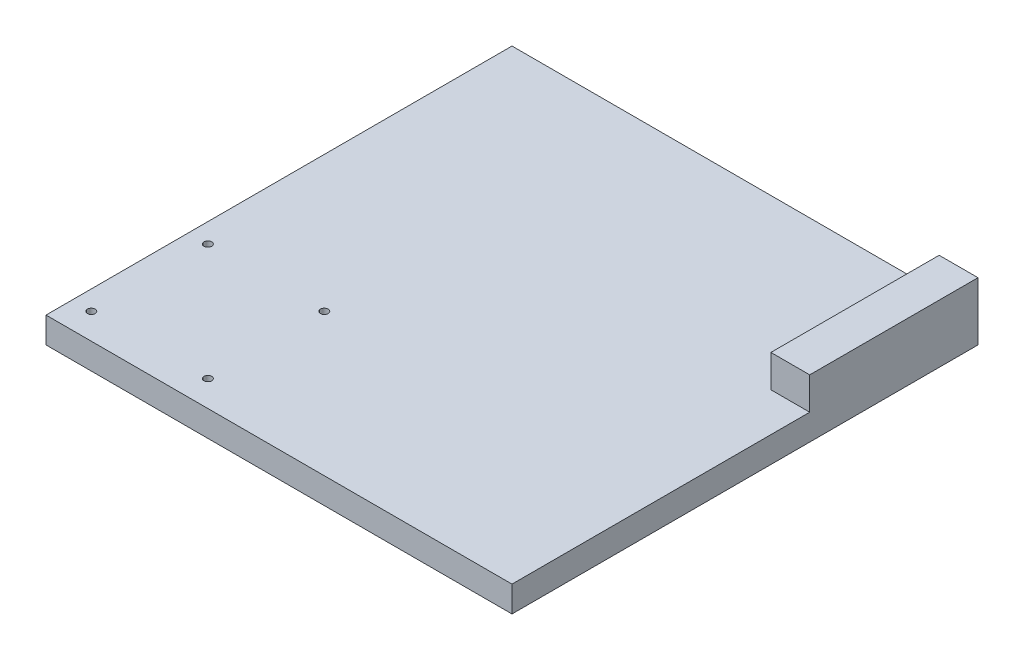
ISO-10303-21;
HEADER;
FILE_DESCRIPTION(('STEP AP214'),'2;1');
FILE_NAME('part.step','',(''),(''),'','','');
FILE_SCHEMA(('AUTOMOTIVE_DESIGN { 1 0 10303 214 1 1 1 1 }'));
ENDSEC;
DATA;
#1=APPLICATION_CONTEXT('core data for automotive mechanical design processes');
#2=APPLICATION_PROTOCOL_DEFINITION('international standard','automotive_design',2000,#1);
#3=PRODUCT_CONTEXT('',#1,'mechanical');
#4=PRODUCT('Part','Part','',(#3));
#5=PRODUCT_RELATED_PRODUCT_CATEGORY('part','',(#4));
#6=PRODUCT_DEFINITION_FORMATION('','',#4);
#7=PRODUCT_DEFINITION_CONTEXT('part definition',#1,'design');
#8=PRODUCT_DEFINITION('design','',#6,#7);
#9=PRODUCT_DEFINITION_SHAPE('','',#8);
#10=(LENGTH_UNIT() NAMED_UNIT(*) SI_UNIT(.MILLI.,.METRE.));
#11=(NAMED_UNIT(*) PLANE_ANGLE_UNIT() SI_UNIT($,.RADIAN.));
#12=(NAMED_UNIT(*) SI_UNIT($,.STERADIAN.) SOLID_ANGLE_UNIT());
#13=UNCERTAINTY_MEASURE_WITH_UNIT(LENGTH_MEASURE(1.E-05),#10,'distance_accuracy_value','');
#14=(GEOMETRIC_REPRESENTATION_CONTEXT(3) GLOBAL_UNCERTAINTY_ASSIGNED_CONTEXT((#13)) GLOBAL_UNIT_ASSIGNED_CONTEXT((#10,
#11,#12)) REPRESENTATION_CONTEXT('',''));
#15=CARTESIAN_POINT('',(0.,0.,0.));
#16=DIRECTION('',(0.,0.,1.));
#17=DIRECTION('',(1.,0.,0.));
#18=AXIS2_PLACEMENT_3D('',#15,#16,#17);
#19=CARTESIAN_POINT('',(0.,20.,-360.));
#20=DIRECTION('',(1.,0.,0.));
#21=DIRECTION('',(0.,0.,-1.));
#22=AXIS2_PLACEMENT_3D('',#19,#20,#21);
#23=PLANE('',#22);
#24=DIRECTION('',(0.,0.,1.));
#25=VECTOR('',#24,1.);
#26=CARTESIAN_POINT('',(0.,0.,-360.));
#27=LINE('',#26,#25);
#28=CARTESIAN_POINT('',(0.,0.,-360.));
#29=VERTEX_POINT('',#28);
#30=CARTESIAN_POINT('',(0.,0.,0.));
#31=VERTEX_POINT('',#30);
#32=EDGE_CURVE('E124',#29,#31,#27,.T.);
#33=ORIENTED_EDGE('',*,*,#32,.T.);
#34=DIRECTION('',(0.,-1.,0.));
#35=VECTOR('',#34,1.);
#36=CARTESIAN_POINT('',(0.,20.,0.));
#37=LINE('',#36,#35);
#38=CARTESIAN_POINT('',(0.,20.,0.));
#39=VERTEX_POINT('',#38);
#40=EDGE_CURVE('E11',#39,#31,#37,.T.);
#41=ORIENTED_EDGE('',*,*,#40,.F.);
#42=DIRECTION('',(0.,0.,1.));
#43=VECTOR('',#42,1.);
#44=CARTESIAN_POINT('',(0.,20.,-360.));
#45=LINE('',#44,#43);
#46=CARTESIAN_POINT('',(0.,20.,-360.));
#47=VERTEX_POINT('',#46);
#48=EDGE_CURVE('E133',#47,#39,#45,.T.);
#49=ORIENTED_EDGE('',*,*,#48,.F.);
#50=DIRECTION('',(0.,-1.,0.));
#51=VECTOR('',#50,1.);
#52=CARTESIAN_POINT('',(0.,20.,-360.));
#53=LINE('',#52,#51);
#54=EDGE_CURVE('E140',#47,#29,#53,.T.);
#55=ORIENTED_EDGE('',*,*,#54,.T.);
#56=EDGE_LOOP('',(#33,#41,#49,#55));
#57=FACE_BOUND('',#56,.T.);
#58=ADVANCED_FACE('F41',(#57),#23,.F.);
#59=CARTESIAN_POINT('',(0.,20.,0.));
#60=DIRECTION('',(0.,0.,-1.));
#61=DIRECTION('',(-1.,0.,0.));
#62=AXIS2_PLACEMENT_3D('',#59,#60,#61);
#63=PLANE('',#62);
#64=DIRECTION('',(1.,0.,0.));
#65=VECTOR('',#64,1.);
#66=CARTESIAN_POINT('',(0.,0.,0.));
#67=LINE('',#66,#65);
#68=CARTESIAN_POINT('',(360.,0.,0.));
#69=VERTEX_POINT('',#68);
#70=EDGE_CURVE('E127',#31,#69,#67,.T.);
#71=ORIENTED_EDGE('',*,*,#70,.T.);
#72=DIRECTION('',(0.,-1.,0.));
#73=VECTOR('',#72,1.);
#74=CARTESIAN_POINT('',(360.,20.,0.));
#75=LINE('',#74,#73);
#76=CARTESIAN_POINT('',(360.,20.,0.));
#77=VERTEX_POINT('',#76);
#78=EDGE_CURVE('E49',#77,#69,#75,.T.);
#79=ORIENTED_EDGE('',*,*,#78,.F.);
#80=DIRECTION('',(1.,0.,0.));
#81=VECTOR('',#80,1.);
#82=CARTESIAN_POINT('',(0.,20.,0.));
#83=LINE('',#82,#81);
#84=EDGE_CURVE('E136',#39,#77,#83,.T.);
#85=ORIENTED_EDGE('',*,*,#84,.F.);
#86=ORIENTED_EDGE('',*,*,#40,.T.);
#87=EDGE_LOOP('',(#71,#79,#85,#86));
#88=FACE_BOUND('',#87,.T.);
#89=ADVANCED_FACE('F207',(#88),#63,.F.);
#90=CARTESIAN_POINT('',(360.,20.,0.));
#91=DIRECTION('',(-1.,0.,0.));
#92=DIRECTION('',(0.,0.,1.));
#93=AXIS2_PLACEMENT_3D('',#90,#91,#92);
#94=PLANE('',#93);
#95=DIRECTION('',(0.,0.,-1.));
#96=VECTOR('',#95,1.);
#97=CARTESIAN_POINT('',(360.,0.,0.));
#98=LINE('',#97,#96);
#99=CARTESIAN_POINT('',(360.,0.,-360.));
#100=VERTEX_POINT('',#99);
#101=EDGE_CURVE('E143',#69,#100,#98,.T.);
#102=ORIENTED_EDGE('',*,*,#101,.T.);
#103=DIRECTION('',(0.,-1.,0.));
#104=VECTOR('',#103,1.);
#105=CARTESIAN_POINT('',(360.,20.,-360.));
#106=LINE('',#105,#104);
#107=CARTESIAN_POINT('',(360.,45.,-360.));
#108=VERTEX_POINT('',#107);
#109=EDGE_CURVE('E148',#108,#100,#106,.T.);
#110=ORIENTED_EDGE('',*,*,#109,.F.);
#111=DIRECTION('',(0.,0.,-1.));
#112=VECTOR('',#111,1.);
#113=CARTESIAN_POINT('',(360.,45.,-360.));
#114=LINE('',#113,#112);
#115=CARTESIAN_POINT('',(360.,45.,-230.));
#116=VERTEX_POINT('',#115);
#117=EDGE_CURVE('E116',#116,#108,#114,.T.);
#118=ORIENTED_EDGE('',*,*,#117,.F.);
#119=DIRECTION('',(0.,-1.,0.));
#120=VECTOR('',#119,1.);
#121=CARTESIAN_POINT('',(360.,45.,-230.));
#122=LINE('',#121,#120);
#123=CARTESIAN_POINT('',(360.,20.,-230.));
#124=VERTEX_POINT('',#123);
#125=EDGE_CURVE('E129',#116,#124,#122,.T.);
#126=ORIENTED_EDGE('',*,*,#125,.T.);
#127=DIRECTION('',(0.,0.,-1.));
#128=VECTOR('',#127,1.);
#129=CARTESIAN_POINT('',(360.,20.,0.));
#130=LINE('',#129,#128);
#131=EDGE_CURVE('E63',#77,#124,#130,.T.);
#132=ORIENTED_EDGE('',*,*,#131,.F.);
#133=ORIENTED_EDGE('',*,*,#78,.T.);
#134=EDGE_LOOP('',(#102,#110,#118,#126,#132,#133));
#135=FACE_BOUND('',#134,.T.);
#136=ADVANCED_FACE('F197',(#135),#94,.F.);
#137=CARTESIAN_POINT('',(360.,20.,-360.));
#138=DIRECTION('',(0.,0.,1.));
#139=DIRECTION('',(1.,0.,0.));
#140=AXIS2_PLACEMENT_3D('',#137,#138,#139);
#141=PLANE('',#140);
#142=DIRECTION('',(-1.,0.,0.));
#143=VECTOR('',#142,1.);
#144=CARTESIAN_POINT('',(360.,0.,-360.));
#145=LINE('',#144,#143);
#146=EDGE_CURVE('E137',#100,#29,#145,.T.);
#147=ORIENTED_EDGE('',*,*,#146,.T.);
#148=ORIENTED_EDGE('',*,*,#54,.F.);
#149=DIRECTION('',(-1.,0.,0.));
#150=VECTOR('',#149,1.);
#151=CARTESIAN_POINT('',(360.,20.,-360.));
#152=LINE('',#151,#150);
#153=CARTESIAN_POINT('',(330.,20.,-360.));
#154=VERTEX_POINT('',#153);
#155=EDGE_CURVE('E123',#154,#47,#152,.T.);
#156=ORIENTED_EDGE('',*,*,#155,.F.);
#157=DIRECTION('',(0.,-1.,0.));
#158=VECTOR('',#157,1.);
#159=CARTESIAN_POINT('',(330.,45.,-360.));
#160=LINE('',#159,#158);
#161=CARTESIAN_POINT('',(330.,45.,-360.));
#162=VERTEX_POINT('',#161);
#163=EDGE_CURVE('E104',#162,#154,#160,.T.);
#164=ORIENTED_EDGE('',*,*,#163,.F.);
#165=DIRECTION('',(-1.,0.,0.));
#166=VECTOR('',#165,1.);
#167=CARTESIAN_POINT('',(330.,45.,-360.));
#168=LINE('',#167,#166);
#169=EDGE_CURVE('E110',#108,#162,#168,.T.);
#170=ORIENTED_EDGE('',*,*,#169,.F.);
#171=ORIENTED_EDGE('',*,*,#109,.T.);
#172=EDGE_LOOP('',(#147,#148,#156,#164,#170,#171));
#173=FACE_BOUND('',#172,.T.);
#174=ADVANCED_FACE('F121',(#173),#141,.F.);
#175=CARTESIAN_POINT('',(0.,20.,0.));
#176=DIRECTION('',(0.,1.,0.));
#177=DIRECTION('',(0.,0.,1.));
#178=AXIS2_PLACEMENT_3D('',#175,#176,#177);
#179=PLANE('',#178);
#180=CARTESIAN_POINT('',(105.,20.,-110.));
#181=DIRECTION('',(0.,1.,0.));
#182=DIRECTION('',(0.,0.,1.));
#183=AXIS2_PLACEMENT_3D('',#180,#181,#182);
#184=CIRCLE('',#183,3.00000000000001);
#185=CARTESIAN_POINT('',(105.,20.,-107.));
#186=VERTEX_POINT('',#185);
#187=EDGE_CURVE('E175',#186,#186,#184,.T.);
#188=ORIENTED_EDGE('',*,*,#187,.F.);
#189=EDGE_LOOP('',(#188));
#190=FACE_BOUND('',#189,.T.);
#191=CARTESIAN_POINT('',(15.,20.,-20.));
#192=DIRECTION('',(0.,1.,0.));
#193=DIRECTION('',(0.,0.,1.));
#194=AXIS2_PLACEMENT_3D('',#191,#192,#193);
#195=CIRCLE('',#194,3.00000000000001);
#196=CARTESIAN_POINT('',(15.,20.,-17.));
#197=VERTEX_POINT('',#196);
#198=EDGE_CURVE('E176',#197,#197,#195,.T.);
#199=ORIENTED_EDGE('',*,*,#198,.F.);
#200=EDGE_LOOP('',(#199));
#201=FACE_BOUND('',#200,.T.);
#202=CARTESIAN_POINT('',(105.,20.,-20.));
#203=DIRECTION('',(0.,1.,0.));
#204=DIRECTION('',(0.,0.,1.));
#205=AXIS2_PLACEMENT_3D('',#202,#203,#204);
#206=CIRCLE('',#205,3.00000000000001);
#207=CARTESIAN_POINT('',(105.,20.,-17.));
#208=VERTEX_POINT('',#207);
#209=EDGE_CURVE('E179',#208,#208,#206,.T.);
#210=ORIENTED_EDGE('',*,*,#209,.F.);
#211=EDGE_LOOP('',(#210));
#212=FACE_BOUND('',#211,.T.);
#213=CARTESIAN_POINT('',(15.,20.,-110.));
#214=DIRECTION('',(0.,1.,0.));
#215=DIRECTION('',(0.,0.,1.));
#216=AXIS2_PLACEMENT_3D('',#213,#214,#215);
#217=CIRCLE('',#216,3.00000000000001);
#218=CARTESIAN_POINT('',(15.,20.,-107.));
#219=VERTEX_POINT('',#218);
#220=EDGE_CURVE('E156',#219,#219,#217,.T.);
#221=ORIENTED_EDGE('',*,*,#220,.F.);
#222=EDGE_LOOP('',(#221));
#223=FACE_BOUND('',#222,.T.);
#224=DIRECTION('',(1.,0.,0.));
#225=VECTOR('',#224,1.);
#226=CARTESIAN_POINT('',(360.,20.,-230.));
#227=LINE('',#226,#225);
#228=CARTESIAN_POINT('',(330.,20.,-230.));
#229=VERTEX_POINT('',#228);
#230=EDGE_CURVE('E119',#229,#124,#227,.T.);
#231=ORIENTED_EDGE('',*,*,#230,.F.);
#232=DIRECTION('',(0.,0.,1.));
#233=VECTOR('',#232,1.);
#234=CARTESIAN_POINT('',(330.,20.,-230.));
#235=LINE('',#234,#233);
#236=EDGE_CURVE('E57',#154,#229,#235,.T.);
#237=ORIENTED_EDGE('',*,*,#236,.F.);
#238=ORIENTED_EDGE('',*,*,#155,.T.);
#239=ORIENTED_EDGE('',*,*,#48,.T.);
#240=ORIENTED_EDGE('',*,*,#84,.T.);
#241=ORIENTED_EDGE('',*,*,#131,.T.);
#242=EDGE_LOOP('',(#231,#237,#238,#239,#240,#241));
#243=FACE_BOUND('',#242,.T.);
#244=ADVANCED_FACE('F188',(#190,#201,#212,#223,#243),#179,.T.);
#245=CARTESIAN_POINT('',(0.,0.,0.));
#246=DIRECTION('',(0.,1.,0.));
#247=DIRECTION('',(0.,0.,1.));
#248=AXIS2_PLACEMENT_3D('',#245,#246,#247);
#249=PLANE('',#248);
#250=CARTESIAN_POINT('',(105.,0.,-110.));
#251=DIRECTION('',(0.,1.,0.));
#252=DIRECTION('',(0.,0.,1.));
#253=AXIS2_PLACEMENT_3D('',#250,#251,#252);
#254=CIRCLE('',#253,3.00000000000001);
#255=CARTESIAN_POINT('',(105.,0.,-107.));
#256=VERTEX_POINT('',#255);
#257=EDGE_CURVE('E44',#256,#256,#254,.T.);
#258=ORIENTED_EDGE('',*,*,#257,.T.);
#259=EDGE_LOOP('',(#258));
#260=FACE_BOUND('',#259,.T.);
#261=CARTESIAN_POINT('',(15.,0.,-20.));
#262=DIRECTION('',(0.,1.,0.));
#263=DIRECTION('',(0.,0.,1.));
#264=AXIS2_PLACEMENT_3D('',#261,#262,#263);
#265=CIRCLE('',#264,3.00000000000001);
#266=CARTESIAN_POINT('',(15.,0.,-17.));
#267=VERTEX_POINT('',#266);
#268=EDGE_CURVE('E158',#267,#267,#265,.T.);
#269=ORIENTED_EDGE('',*,*,#268,.T.);
#270=EDGE_LOOP('',(#269));
#271=FACE_BOUND('',#270,.T.);
#272=CARTESIAN_POINT('',(105.,0.,-20.));
#273=DIRECTION('',(0.,1.,0.));
#274=DIRECTION('',(0.,0.,1.));
#275=AXIS2_PLACEMENT_3D('',#272,#273,#274);
#276=CIRCLE('',#275,3.00000000000001);
#277=CARTESIAN_POINT('',(105.,0.,-17.));
#278=VERTEX_POINT('',#277);
#279=EDGE_CURVE('E155',#278,#278,#276,.T.);
#280=ORIENTED_EDGE('',*,*,#279,.T.);
#281=EDGE_LOOP('',(#280));
#282=FACE_BOUND('',#281,.T.);
#283=CARTESIAN_POINT('',(15.,0.,-110.));
#284=DIRECTION('',(0.,1.,0.));
#285=DIRECTION('',(0.,0.,1.));
#286=AXIS2_PLACEMENT_3D('',#283,#284,#285);
#287=CIRCLE('',#286,3.00000000000001);
#288=CARTESIAN_POINT('',(15.,0.,-107.));
#289=VERTEX_POINT('',#288);
#290=EDGE_CURVE('E152',#289,#289,#287,.T.);
#291=ORIENTED_EDGE('',*,*,#290,.T.);
#292=EDGE_LOOP('',(#291));
#293=FACE_BOUND('',#292,.T.);
#294=ORIENTED_EDGE('',*,*,#32,.F.);
#295=ORIENTED_EDGE('',*,*,#146,.F.);
#296=ORIENTED_EDGE('',*,*,#101,.F.);
#297=ORIENTED_EDGE('',*,*,#70,.F.);
#298=EDGE_LOOP('',(#294,#295,#296,#297));
#299=FACE_BOUND('',#298,.T.);
#300=ADVANCED_FACE('F191',(#260,#271,#282,#293,#299),#249,.F.);
#301=CARTESIAN_POINT('',(330.,45.,-230.));
#302=DIRECTION('',(1.,0.,0.));
#303=DIRECTION('',(0.,0.,-1.));
#304=AXIS2_PLACEMENT_3D('',#301,#302,#303);
#305=PLANE('',#304);
#306=ORIENTED_EDGE('',*,*,#236,.T.);
#307=DIRECTION('',(0.,-1.,0.));
#308=VECTOR('',#307,1.);
#309=CARTESIAN_POINT('',(330.,45.,-230.));
#310=LINE('',#309,#308);
#311=CARTESIAN_POINT('',(330.,45.,-230.));
#312=VERTEX_POINT('',#311);
#313=EDGE_CURVE('E106',#312,#229,#310,.T.);
#314=ORIENTED_EDGE('',*,*,#313,.F.);
#315=DIRECTION('',(0.,0.,1.));
#316=VECTOR('',#315,1.);
#317=CARTESIAN_POINT('',(330.,45.,-230.));
#318=LINE('',#317,#316);
#319=EDGE_CURVE('E100',#162,#312,#318,.T.);
#320=ORIENTED_EDGE('',*,*,#319,.F.);
#321=ORIENTED_EDGE('',*,*,#163,.T.);
#322=EDGE_LOOP('',(#306,#314,#320,#321));
#323=FACE_BOUND('',#322,.T.);
#324=ADVANCED_FACE('F102',(#323),#305,.F.);
#325=CARTESIAN_POINT('',(360.,45.,-230.));
#326=DIRECTION('',(0.,0.,-1.));
#327=DIRECTION('',(-1.,0.,0.));
#328=AXIS2_PLACEMENT_3D('',#325,#326,#327);
#329=PLANE('',#328);
#330=ORIENTED_EDGE('',*,*,#230,.T.);
#331=ORIENTED_EDGE('',*,*,#125,.F.);
#332=DIRECTION('',(1.,0.,0.));
#333=VECTOR('',#332,1.);
#334=CARTESIAN_POINT('',(360.,45.,-230.));
#335=LINE('',#334,#333);
#336=EDGE_CURVE('E109',#312,#116,#335,.T.);
#337=ORIENTED_EDGE('',*,*,#336,.F.);
#338=ORIENTED_EDGE('',*,*,#313,.T.);
#339=EDGE_LOOP('',(#330,#331,#337,#338));
#340=FACE_BOUND('',#339,.T.);
#341=ADVANCED_FACE('F196',(#340),#329,.F.);
#342=CARTESIAN_POINT('',(0.,45.,0.));
#343=DIRECTION('',(0.,-1.,0.));
#344=DIRECTION('',(0.,0.,-1.));
#345=AXIS2_PLACEMENT_3D('',#342,#343,#344);
#346=PLANE('',#345);
#347=ORIENTED_EDGE('',*,*,#169,.T.);
#348=ORIENTED_EDGE('',*,*,#319,.T.);
#349=ORIENTED_EDGE('',*,*,#336,.T.);
#350=ORIENTED_EDGE('',*,*,#117,.T.);
#351=EDGE_LOOP('',(#347,#348,#349,#350));
#352=FACE_BOUND('',#351,.T.);
#353=ADVANCED_FACE('F114',(#352),#346,.F.);
#354=CARTESIAN_POINT('',(15.,-5.,-110.));
#355=DIRECTION('',(0.,1.,0.));
#356=DIRECTION('',(0.,0.,1.));
#357=AXIS2_PLACEMENT_3D('',#354,#355,#356);
#358=CYLINDRICAL_SURFACE('',#357,3.00000000000001);
#359=ORIENTED_EDGE('',*,*,#220,.T.);
#360=EDGE_LOOP('',(#359));
#361=FACE_BOUND('',#360,.T.);
#362=ORIENTED_EDGE('',*,*,#290,.F.);
#363=EDGE_LOOP('',(#362));
#364=FACE_BOUND('',#363,.T.);
#365=ADVANCED_FACE('F225',(#361,#364),#358,.F.);
#366=CARTESIAN_POINT('',(105.,-5.,-20.));
#367=DIRECTION('',(0.,1.,0.));
#368=DIRECTION('',(0.,0.,1.));
#369=AXIS2_PLACEMENT_3D('',#366,#367,#368);
#370=CYLINDRICAL_SURFACE('',#369,3.00000000000001);
#371=ORIENTED_EDGE('',*,*,#209,.T.);
#372=EDGE_LOOP('',(#371));
#373=FACE_BOUND('',#372,.T.);
#374=ORIENTED_EDGE('',*,*,#279,.F.);
#375=EDGE_LOOP('',(#374));
#376=FACE_BOUND('',#375,.T.);
#377=ADVANCED_FACE('F185',(#373,#376),#370,.F.);
#378=CARTESIAN_POINT('',(15.,-5.,-20.));
#379=DIRECTION('',(0.,1.,0.));
#380=DIRECTION('',(0.,0.,1.));
#381=AXIS2_PLACEMENT_3D('',#378,#379,#380);
#382=CYLINDRICAL_SURFACE('',#381,3.00000000000001);
#383=ORIENTED_EDGE('',*,*,#198,.T.);
#384=EDGE_LOOP('',(#383));
#385=FACE_BOUND('',#384,.T.);
#386=ORIENTED_EDGE('',*,*,#268,.F.);
#387=EDGE_LOOP('',(#386));
#388=FACE_BOUND('',#387,.T.);
#389=ADVANCED_FACE('F229',(#385,#388),#382,.F.);
#390=CARTESIAN_POINT('',(105.,-5.,-110.));
#391=DIRECTION('',(0.,1.,0.));
#392=DIRECTION('',(0.,0.,1.));
#393=AXIS2_PLACEMENT_3D('',#390,#391,#392);
#394=CYLINDRICAL_SURFACE('',#393,3.00000000000001);
#395=ORIENTED_EDGE('',*,*,#187,.T.);
#396=EDGE_LOOP('',(#395));
#397=FACE_BOUND('',#396,.T.);
#398=ORIENTED_EDGE('',*,*,#257,.F.);
#399=EDGE_LOOP('',(#398));
#400=FACE_BOUND('',#399,.T.);
#401=ADVANCED_FACE('F232',(#397,#400),#394,.F.);
#402=CLOSED_SHELL('',(#58,#89,#136,#174,#244,#300,#324,#341,#353,#365,#377,#389,#401));
#403=MANIFOLD_SOLID_BREP('B2',#402);
#404=ADVANCED_BREP_SHAPE_REPRESENTATION('',(#18,#403),#14);
#405=SHAPE_DEFINITION_REPRESENTATION(#9,#404);
ENDSEC;
END-ISO-10303-21;
